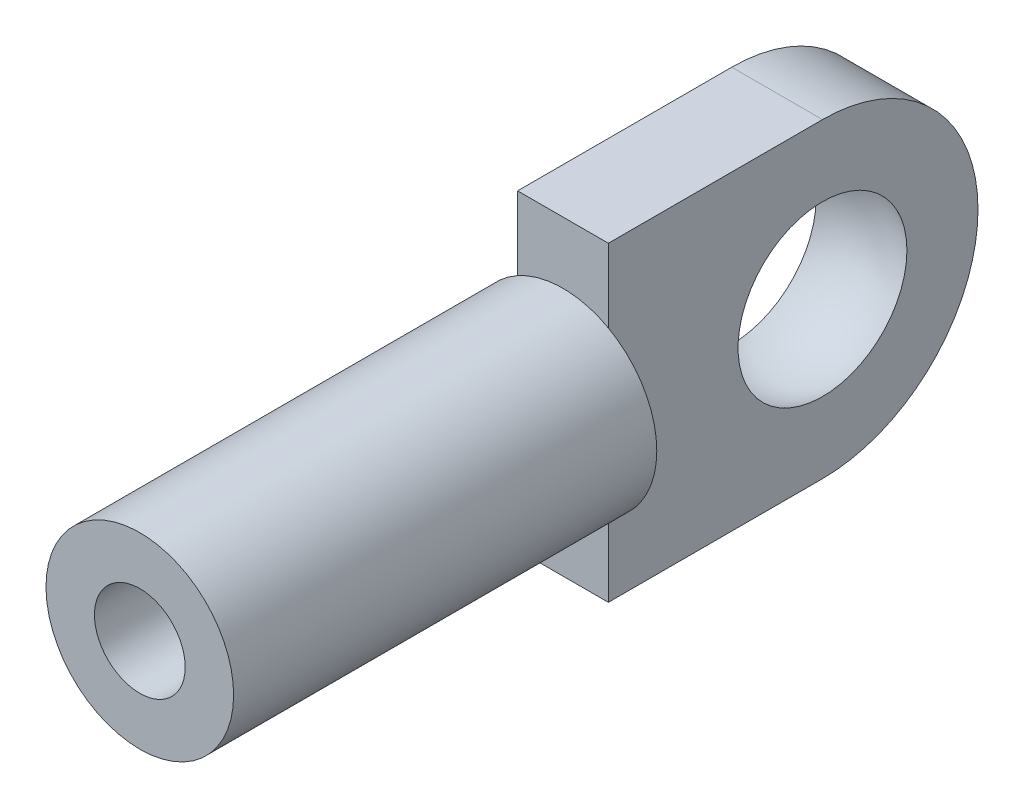
ISO-10303-21;
HEADER;
FILE_DESCRIPTION(('STEP AP214'),'2;1');
FILE_NAME('part.step','',(''),(''),'','','');
FILE_SCHEMA(('AUTOMOTIVE_DESIGN { 1 0 10303 214 1 1 1 1 }'));
ENDSEC;
DATA;
#1=APPLICATION_CONTEXT('core data for automotive mechanical design processes');
#2=APPLICATION_PROTOCOL_DEFINITION('international standard','automotive_design',2000,#1);
#3=PRODUCT_CONTEXT('',#1,'mechanical');
#4=PRODUCT('Part','Part','',(#3));
#5=PRODUCT_RELATED_PRODUCT_CATEGORY('part','',(#4));
#6=PRODUCT_DEFINITION_FORMATION('','',#4);
#7=PRODUCT_DEFINITION_CONTEXT('part definition',#1,'design');
#8=PRODUCT_DEFINITION('design','',#6,#7);
#9=PRODUCT_DEFINITION_SHAPE('','',#8);
#10=(LENGTH_UNIT() NAMED_UNIT(*) SI_UNIT(.MILLI.,.METRE.));
#11=(NAMED_UNIT(*) PLANE_ANGLE_UNIT() SI_UNIT($,.RADIAN.));
#12=(NAMED_UNIT(*) SI_UNIT($,.STERADIAN.) SOLID_ANGLE_UNIT());
#13=UNCERTAINTY_MEASURE_WITH_UNIT(LENGTH_MEASURE(1.E-05),#10,'distance_accuracy_value','');
#14=(GEOMETRIC_REPRESENTATION_CONTEXT(3) GLOBAL_UNCERTAINTY_ASSIGNED_CONTEXT((#13)) GLOBAL_UNIT_ASSIGNED_CONTEXT((#10,
#11,#12)) REPRESENTATION_CONTEXT('',''));
#15=CARTESIAN_POINT('',(0.,0.,0.));
#16=DIRECTION('',(0.,0.,1.));
#17=DIRECTION('',(1.,0.,0.));
#18=AXIS2_PLACEMENT_3D('',#15,#16,#17);
#19=CARTESIAN_POINT('',(0.,0.,0.));
#20=DIRECTION('',(0.,0.,1.));
#21=DIRECTION('',(1.,0.,0.));
#22=AXIS2_PLACEMENT_3D('',#19,#20,#21);
#23=PLANE('',#22);
#24=DIRECTION('',(0.,-1.,0.));
#25=VECTOR('',#24,1.);
#26=CARTESIAN_POINT('',(1.1303,0.,0.));
#27=LINE('',#26,#25);
#28=CARTESIAN_POINT('',(1.1303,2.04525209937553,0.));
#29=VERTEX_POINT('',#28);
#30=CARTESIAN_POINT('',(1.1303,-2.04525209937553,0.));
#31=VERTEX_POINT('',#30);
#32=EDGE_CURVE('E11',#29,#31,#27,.T.);
#33=ORIENTED_EDGE('',*,*,#32,.F.);
#34=CARTESIAN_POINT('',(0.,0.,0.));
#35=DIRECTION('',(0.,0.,1.));
#36=DIRECTION('',(1.,0.,0.));
#37=AXIS2_PLACEMENT_3D('',#34,#35,#36);
#38=CIRCLE('',#37,2.3368);
#39=EDGE_CURVE('E126',#31,#29,#38,.T.);
#40=ORIENTED_EDGE('',*,*,#39,.F.);
#41=EDGE_LOOP('',(#33,#40));
#42=FACE_BOUND('',#41,.T.);
#43=ADVANCED_FACE('F33',(#42),#23,.F.);
#44=CARTESIAN_POINT('',(0.,0.,10.541));
#45=DIRECTION('',(0.,0.,-1.));
#46=DIRECTION('',(-1.,0.,0.));
#47=AXIS2_PLACEMENT_3D('',#44,#45,#46);
#48=CYLINDRICAL_SURFACE('',#47,2.3368);
#49=CARTESIAN_POINT('',(0.,0.,10.541));
#50=DIRECTION('',(0.,0.,1.));
#51=DIRECTION('',(1.,0.,0.));
#52=AXIS2_PLACEMENT_3D('',#49,#50,#51);
#53=CIRCLE('',#52,2.3368);
#54=CARTESIAN_POINT('',(2.3368,0.,10.541));
#55=VERTEX_POINT('',#54);
#56=EDGE_CURVE('E130',#55,#55,#53,.T.);
#57=ORIENTED_EDGE('',*,*,#56,.F.);
#58=EDGE_LOOP('',(#57));
#59=FACE_BOUND('',#58,.T.);
#60=CARTESIAN_POINT('',(-1.1303,2.04525209937553,0.));
#61=VERTEX_POINT('',#60);
#62=EDGE_CURVE('E132',#29,#61,#38,.T.);
#63=ORIENTED_EDGE('',*,*,#62,.T.);
#64=CARTESIAN_POINT('',(-1.1303,-2.04525209937553,0.));
#65=VERTEX_POINT('',#64);
#66=EDGE_CURVE('E134',#61,#65,#38,.T.);
#67=ORIENTED_EDGE('',*,*,#66,.T.);
#68=EDGE_CURVE('E138',#65,#31,#38,.T.);
#69=ORIENTED_EDGE('',*,*,#68,.T.);
#70=ORIENTED_EDGE('',*,*,#39,.T.);
#71=EDGE_LOOP('',(#63,#67,#69,#70));
#72=FACE_BOUND('',#71,.T.);
#73=ADVANCED_FACE('F35',(#59,#72),#48,.T.);
#74=CARTESIAN_POINT('',(0.,0.,10.541));
#75=DIRECTION('',(0.,0.,1.));
#76=DIRECTION('',(1.,0.,0.));
#77=AXIS2_PLACEMENT_3D('',#74,#75,#76);
#78=PLANE('',#77);
#79=CARTESIAN_POINT('',(0.,0.,10.541));
#80=DIRECTION('',(0.,0.,1.));
#81=DIRECTION('',(1.,0.,0.));
#82=AXIS2_PLACEMENT_3D('',#79,#80,#81);
#83=CIRCLE('',#82,1.1303);
#84=CARTESIAN_POINT('',(1.1303,0.,10.541));
#85=VERTEX_POINT('',#84);
#86=EDGE_CURVE('E288',#85,#85,#83,.T.);
#87=ORIENTED_EDGE('',*,*,#86,.F.);
#88=EDGE_LOOP('',(#87));
#89=FACE_BOUND('',#88,.T.);
#90=ORIENTED_EDGE('',*,*,#56,.T.);
#91=EDGE_LOOP('',(#90));
#92=FACE_BOUND('',#91,.T.);
#93=ADVANCED_FACE('F145',(#89,#92),#78,.T.);
#94=ORIENTED_EDGE('',*,*,#66,.F.);
#95=DIRECTION('',(0.,-1.,0.));
#96=VECTOR('',#95,1.);
#97=CARTESIAN_POINT('',(-1.1303,0.,0.));
#98=LINE('',#97,#96);
#99=EDGE_CURVE('E42',#61,#65,#98,.T.);
#100=ORIENTED_EDGE('',*,*,#99,.T.);
#101=EDGE_LOOP('',(#94,#100));
#102=FACE_BOUND('',#101,.T.);
#103=ADVANCED_FACE('F142',(#102),#23,.F.);
#104=CARTESIAN_POINT('',(-1.1303,0.,0.));
#105=DIRECTION('',(0.,0.,1.));
#106=DIRECTION('',(1.,0.,0.));
#107=AXIS2_PLACEMENT_3D('',#104,#105,#106);
#108=PLANE('',#107);
#109=ORIENTED_EDGE('',*,*,#62,.F.);
#110=CARTESIAN_POINT('',(1.1303,3.8735,0.));
#111=VERTEX_POINT('',#110);
#112=EDGE_CURVE('E44',#111,#29,#27,.T.);
#113=ORIENTED_EDGE('',*,*,#112,.F.);
#114=DIRECTION('',(1.,0.,0.));
#115=VECTOR('',#114,1.);
#116=CARTESIAN_POINT('',(-1.1303,3.8735,0.));
#117=LINE('',#116,#115);
#118=CARTESIAN_POINT('',(-1.1303,3.8735,0.));
#119=VERTEX_POINT('',#118);
#120=EDGE_CURVE('E124',#119,#111,#117,.T.);
#121=ORIENTED_EDGE('',*,*,#120,.F.);
#122=EDGE_CURVE('E115',#119,#61,#98,.T.);
#123=ORIENTED_EDGE('',*,*,#122,.T.);
#124=EDGE_LOOP('',(#109,#113,#121,#123));
#125=FACE_BOUND('',#124,.T.);
#126=ADVANCED_FACE('F144',(#125),#108,.T.);
#127=ORIENTED_EDGE('',*,*,#68,.F.);
#128=CARTESIAN_POINT('',(-1.1303,-3.8735,0.));
#129=VERTEX_POINT('',#128);
#130=EDGE_CURVE('E52',#65,#129,#98,.T.);
#131=ORIENTED_EDGE('',*,*,#130,.T.);
#132=DIRECTION('',(1.,0.,0.));
#133=VECTOR('',#132,1.);
#134=CARTESIAN_POINT('',(-1.1303,-3.8735,0.));
#135=LINE('',#134,#133);
#136=CARTESIAN_POINT('',(1.1303,-3.8735,0.));
#137=VERTEX_POINT('',#136);
#138=EDGE_CURVE('E99',#129,#137,#135,.T.);
#139=ORIENTED_EDGE('',*,*,#138,.T.);
#140=EDGE_CURVE('E45',#31,#137,#27,.T.);
#141=ORIENTED_EDGE('',*,*,#140,.F.);
#142=EDGE_LOOP('',(#127,#131,#139,#141));
#143=FACE_BOUND('',#142,.T.);
#144=ADVANCED_FACE('F100',(#143),#108,.T.);
#145=CARTESIAN_POINT('',(-1.1303,3.8735,-5.334));
#146=DIRECTION('',(0.,1.,0.));
#147=DIRECTION('',(0.,0.,1.));
#148=AXIS2_PLACEMENT_3D('',#145,#146,#147);
#149=PLANE('',#148);
#150=ORIENTED_EDGE('',*,*,#120,.T.);
#151=DIRECTION('',(0.,0.,1.));
#152=VECTOR('',#151,1.);
#153=CARTESIAN_POINT('',(1.1303,3.8735,-5.334));
#154=LINE('',#153,#152);
#155=CARTESIAN_POINT('',(1.1303,3.8735,-5.334));
#156=VERTEX_POINT('',#155);
#157=EDGE_CURVE('E109',#156,#111,#154,.T.);
#158=ORIENTED_EDGE('',*,*,#157,.F.);
#159=DIRECTION('',(1.,0.,0.));
#160=VECTOR('',#159,1.);
#161=CARTESIAN_POINT('',(-1.1303,3.8735,-5.334));
#162=LINE('',#161,#160);
#163=CARTESIAN_POINT('',(-1.1303,3.8735,-5.334));
#164=VERTEX_POINT('',#163);
#165=EDGE_CURVE('E127',#164,#156,#162,.T.);
#166=ORIENTED_EDGE('',*,*,#165,.F.);
#167=DIRECTION('',(0.,0.,1.));
#168=VECTOR('',#167,1.);
#169=CARTESIAN_POINT('',(-1.1303,3.8735,-5.334));
#170=LINE('',#169,#168);
#171=EDGE_CURVE('E104',#164,#119,#170,.T.);
#172=ORIENTED_EDGE('',*,*,#171,.T.);
#173=EDGE_LOOP('',(#150,#158,#166,#172));
#174=FACE_BOUND('',#173,.T.);
#175=ADVANCED_FACE('F210',(#174),#149,.T.);
#176=CARTESIAN_POINT('',(-1.1303,0.,-5.334));
#177=DIRECTION('',(1.,0.,0.));
#178=DIRECTION('',(0.,0.,-1.));
#179=AXIS2_PLACEMENT_3D('',#176,#177,#178);
#180=CYLINDRICAL_SURFACE('',#179,3.8735);
#181=ORIENTED_EDGE('',*,*,#165,.T.);
#182=CARTESIAN_POINT('',(1.1303,0.,-5.334));
#183=DIRECTION('',(1.,0.,0.));
#184=DIRECTION('',(0.,0.,-1.));
#185=AXIS2_PLACEMENT_3D('',#182,#183,#184);
#186=CIRCLE('',#185,3.8735);
#187=CARTESIAN_POINT('',(1.1303,-3.8735,-5.334));
#188=VERTEX_POINT('',#187);
#189=EDGE_CURVE('E107',#188,#156,#186,.T.);
#190=ORIENTED_EDGE('',*,*,#189,.F.);
#191=DIRECTION('',(1.,0.,0.));
#192=VECTOR('',#191,1.);
#193=CARTESIAN_POINT('',(-1.1303,-3.8735,-5.334));
#194=LINE('',#193,#192);
#195=CARTESIAN_POINT('',(-1.1303,-3.8735,-5.334));
#196=VERTEX_POINT('',#195);
#197=EDGE_CURVE('E103',#196,#188,#194,.T.);
#198=ORIENTED_EDGE('',*,*,#197,.F.);
#199=CARTESIAN_POINT('',(-1.1303,0.,-5.334));
#200=DIRECTION('',(1.,0.,0.));
#201=DIRECTION('',(0.,0.,-1.));
#202=AXIS2_PLACEMENT_3D('',#199,#200,#201);
#203=CIRCLE('',#202,3.8735);
#204=EDGE_CURVE('E119',#196,#164,#203,.T.);
#205=ORIENTED_EDGE('',*,*,#204,.T.);
#206=EDGE_LOOP('',(#181,#190,#198,#205));
#207=FACE_BOUND('',#206,.T.);
#208=ADVANCED_FACE('F213',(#207),#180,.T.);
#209=CARTESIAN_POINT('',(-1.1303,-3.8735,-5.334));
#210=DIRECTION('',(0.,-1.,0.));
#211=DIRECTION('',(0.,0.,-1.));
#212=AXIS2_PLACEMENT_3D('',#209,#210,#211);
#213=PLANE('',#212);
#214=ORIENTED_EDGE('',*,*,#197,.T.);
#215=DIRECTION('',(0.,0.,-1.));
#216=VECTOR('',#215,1.);
#217=CARTESIAN_POINT('',(1.1303,-3.8735,-5.334));
#218=LINE('',#217,#216);
#219=EDGE_CURVE('E92',#137,#188,#218,.T.);
#220=ORIENTED_EDGE('',*,*,#219,.F.);
#221=ORIENTED_EDGE('',*,*,#138,.F.);
#222=DIRECTION('',(0.,0.,-1.));
#223=VECTOR('',#222,1.);
#224=CARTESIAN_POINT('',(-1.1303,-3.8735,-5.334));
#225=LINE('',#224,#223);
#226=EDGE_CURVE('E117',#129,#196,#225,.T.);
#227=ORIENTED_EDGE('',*,*,#226,.T.);
#228=EDGE_LOOP('',(#214,#220,#221,#227));
#229=FACE_BOUND('',#228,.T.);
#230=ADVANCED_FACE('F106',(#229),#213,.T.);
#231=CARTESIAN_POINT('',(-1.1303,0.,-5.334));
#232=DIRECTION('',(1.,0.,0.));
#233=DIRECTION('',(0.,0.,-1.));
#234=AXIS2_PLACEMENT_3D('',#231,#232,#233);
#235=PLANE('',#234);
#236=CARTESIAN_POINT('',(-1.1303,0.,-5.334));
#237=DIRECTION('',(1.,0.,0.));
#238=DIRECTION('',(0.,0.,-1.));
#239=AXIS2_PLACEMENT_3D('',#236,#237,#238);
#240=CIRCLE('',#239,2.10310619560687);
#241=CARTESIAN_POINT('',(-1.1303,0.,-7.43710619560687));
#242=VERTEX_POINT('',#241);
#243=EDGE_CURVE('E97',#242,#242,#240,.T.);
#244=ORIENTED_EDGE('',*,*,#243,.T.);
#245=EDGE_LOOP('',(#244));
#246=FACE_BOUND('',#245,.T.);
#247=ORIENTED_EDGE('',*,*,#122,.F.);
#248=ORIENTED_EDGE('',*,*,#171,.F.);
#249=ORIENTED_EDGE('',*,*,#204,.F.);
#250=ORIENTED_EDGE('',*,*,#226,.F.);
#251=ORIENTED_EDGE('',*,*,#130,.F.);
#252=ORIENTED_EDGE('',*,*,#99,.F.);
#253=EDGE_LOOP('',(#247,#248,#249,#250,#251,#252));
#254=FACE_BOUND('',#253,.T.);
#255=ADVANCED_FACE('F205',(#246,#254),#235,.F.);
#256=CARTESIAN_POINT('',(1.1303,0.,-5.334));
#257=DIRECTION('',(1.,0.,0.));
#258=DIRECTION('',(0.,0.,-1.));
#259=AXIS2_PLACEMENT_3D('',#256,#257,#258);
#260=PLANE('',#259);
#261=CARTESIAN_POINT('',(1.1303,0.,-5.334));
#262=DIRECTION('',(1.,0.,0.));
#263=DIRECTION('',(0.,0.,-1.));
#264=AXIS2_PLACEMENT_3D('',#261,#262,#263);
#265=CIRCLE('',#264,2.10310619560687);
#266=CARTESIAN_POINT('',(1.1303,0.,-7.43710619560687));
#267=VERTEX_POINT('',#266);
#268=EDGE_CURVE('E37',#267,#267,#265,.T.);
#269=ORIENTED_EDGE('',*,*,#268,.F.);
#270=EDGE_LOOP('',(#269));
#271=FACE_BOUND('',#270,.T.);
#272=ORIENTED_EDGE('',*,*,#112,.T.);
#273=ORIENTED_EDGE('',*,*,#32,.T.);
#274=ORIENTED_EDGE('',*,*,#140,.T.);
#275=ORIENTED_EDGE('',*,*,#219,.T.);
#276=ORIENTED_EDGE('',*,*,#189,.T.);
#277=ORIENTED_EDGE('',*,*,#157,.T.);
#278=EDGE_LOOP('',(#272,#273,#274,#275,#276,#277));
#279=FACE_BOUND('',#278,.T.);
#280=ADVANCED_FACE('F89',(#271,#279),#260,.T.);
#281=CARTESIAN_POINT('',(0.,0.,-5.334));
#282=DIRECTION('',(0.,1.,0.));
#283=DIRECTION('',(0.,0.,-1.));
#284=AXIS2_PLACEMENT_3D('',#281,#282,#283);
#285=SPHERICAL_SURFACE('',#284,2.3876);
#286=CARTESIAN_POINT('',(0.,0.,-5.334));
#287=DIRECTION('',(1.,0.,0.));
#288=DIRECTION('',(0.,0.,-1.));
#289=AXIS2_PLACEMENT_3D('',#286,#287,#288);
#290=SPHERICAL_SURFACE('',#289,2.3876);
#291=ORIENTED_EDGE('',*,*,#268,.T.);
#292=EDGE_LOOP('',(#291));
#293=FACE_BOUND('',#292,.T.);
#294=ORIENTED_EDGE('',*,*,#243,.F.);
#295=EDGE_LOOP('',(#294));
#296=FACE_BOUND('',#295,.T.);
#297=ADVANCED_FACE('F175',(#293,#296),#290,.F.);
#298=CARTESIAN_POINT('',(0.,0.,2.54));
#299=DIRECTION('',(0.,0.,1.));
#300=DIRECTION('',(1.,0.,0.));
#301=AXIS2_PLACEMENT_3D('',#298,#299,#300);
#302=CYLINDRICAL_SURFACE('',#301,1.1303);
#303=CARTESIAN_POINT('',(0.,0.,2.54));
#304=DIRECTION('',(0.,0.,1.));
#305=DIRECTION('',(1.,0.,0.));
#306=AXIS2_PLACEMENT_3D('',#303,#304,#305);
#307=CIRCLE('',#306,1.1303);
#308=CARTESIAN_POINT('',(1.1303,0.,2.54));
#309=VERTEX_POINT('',#308);
#310=EDGE_CURVE('E286',#309,#309,#307,.T.);
#311=ORIENTED_EDGE('',*,*,#310,.F.);
#312=EDGE_LOOP('',(#311));
#313=FACE_BOUND('',#312,.T.);
#314=ORIENTED_EDGE('',*,*,#86,.T.);
#315=EDGE_LOOP('',(#314));
#316=FACE_BOUND('',#315,.T.);
#317=ADVANCED_FACE('F180',(#313,#316),#302,.F.);
#318=CARTESIAN_POINT('',(0.,0.,2.54));
#319=DIRECTION('',(0.,0.,1.));
#320=DIRECTION('',(1.,0.,0.));
#321=AXIS2_PLACEMENT_3D('',#318,#319,#320);
#322=PLANE('',#321);
#323=ORIENTED_EDGE('',*,*,#310,.T.);
#324=EDGE_LOOP('',(#323));
#325=FACE_BOUND('',#324,.T.);
#326=ADVANCED_FACE('F185',(#325),#322,.T.);
#327=CLOSED_SHELL('',(#43,#73,#93,#103,#126,#144,#175,#208,#230,#255,#280,#297,#317,#326));
#328=MANIFOLD_SOLID_BREP('B2',#327);
#329=ADVANCED_BREP_SHAPE_REPRESENTATION('',(#18,#328),#14);
#330=SHAPE_DEFINITION_REPRESENTATION(#9,#329);
ENDSEC;
END-ISO-10303-21;
